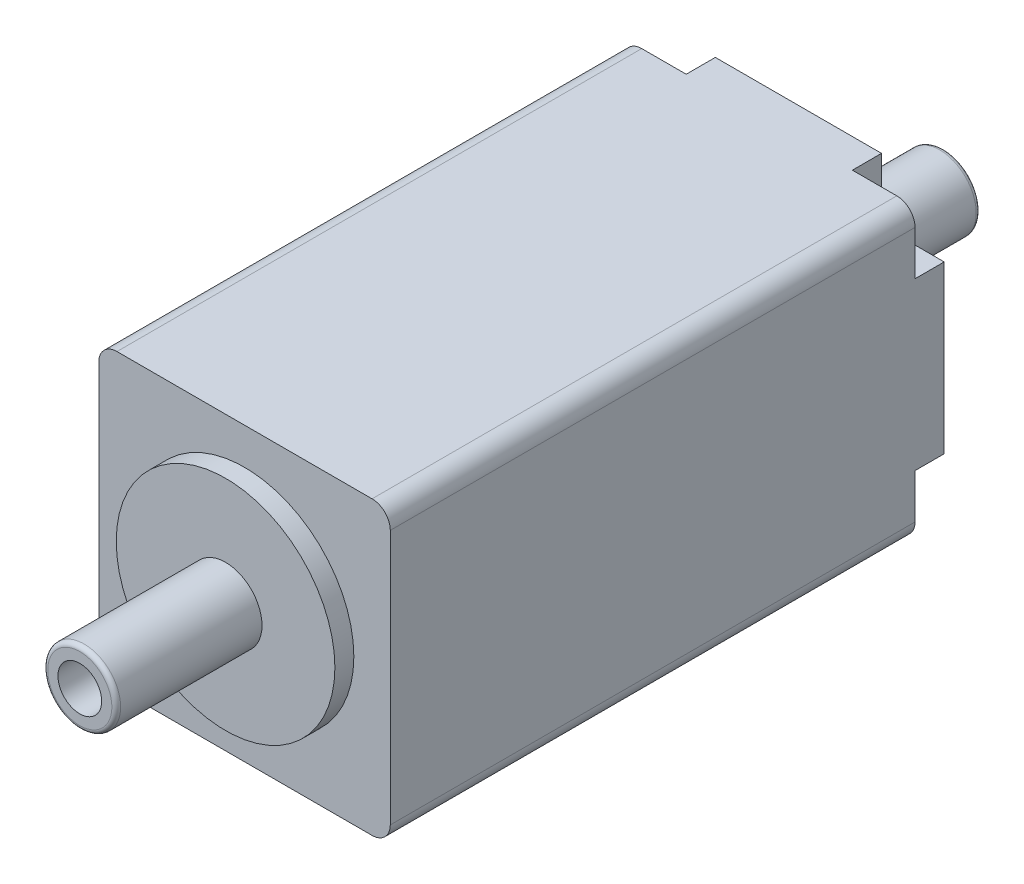
ISO-10303-21;
HEADER;
FILE_DESCRIPTION(('STEP AP214'),'2;1');
FILE_NAME('part.step','',(''),(''),'','','');
FILE_SCHEMA(('AUTOMOTIVE_DESIGN { 1 0 10303 214 1 1 1 1 }'));
ENDSEC;
DATA;
#1=APPLICATION_CONTEXT('core data for automotive mechanical design processes');
#2=APPLICATION_PROTOCOL_DEFINITION('international standard','automotive_design',2000,#1);
#3=PRODUCT_CONTEXT('',#1,'mechanical');
#4=PRODUCT('Part','Part','',(#3));
#5=PRODUCT_RELATED_PRODUCT_CATEGORY('part','',(#4));
#6=PRODUCT_DEFINITION_FORMATION('','',#4);
#7=PRODUCT_DEFINITION_CONTEXT('part definition',#1,'design');
#8=PRODUCT_DEFINITION('design','',#6,#7);
#9=PRODUCT_DEFINITION_SHAPE('','',#8);
#10=(LENGTH_UNIT() NAMED_UNIT(*) SI_UNIT(.MILLI.,.METRE.));
#11=(NAMED_UNIT(*) PLANE_ANGLE_UNIT() SI_UNIT($,.RADIAN.));
#12=(NAMED_UNIT(*) SI_UNIT($,.STERADIAN.) SOLID_ANGLE_UNIT());
#13=UNCERTAINTY_MEASURE_WITH_UNIT(LENGTH_MEASURE(1.E-05),#10,'distance_accuracy_value','');
#14=(GEOMETRIC_REPRESENTATION_CONTEXT(3) GLOBAL_UNCERTAINTY_ASSIGNED_CONTEXT((#13)) GLOBAL_UNIT_ASSIGNED_CONTEXT((#10,
#11,#12)) REPRESENTATION_CONTEXT('',''));
#15=CARTESIAN_POINT('',(0.,0.,0.));
#16=DIRECTION('',(0.,0.,1.));
#17=DIRECTION('',(1.,0.,0.));
#18=AXIS2_PLACEMENT_3D('',#15,#16,#17);
#19=CARTESIAN_POINT('',(-10.,0.,-38.));
#20=DIRECTION('',(1.,0.,0.));
#21=DIRECTION('',(0.,0.,-1.));
#22=AXIS2_PLACEMENT_3D('',#19,#20,#21);
#23=PLANE('',#22);
#24=DIRECTION('',(0.,1.,0.));
#25=VECTOR('',#24,1.);
#26=CARTESIAN_POINT('',(-9.99999999999999,10.,-36.));
#27=LINE('',#26,#25);
#28=CARTESIAN_POINT('',(-9.99999999999999,5.7,-36.));
#29=VERTEX_POINT('',#28);
#30=CARTESIAN_POINT('',(-9.99999999999999,8.75,-36.));
#31=VERTEX_POINT('',#30);
#32=EDGE_CURVE('E740',#29,#31,#27,.T.);
#33=ORIENTED_EDGE('',*,*,#32,.F.);
#34=DIRECTION('',(0.,0.,-1.));
#35=VECTOR('',#34,1.);
#36=CARTESIAN_POINT('',(-9.99999999999999,5.7,-36.));
#37=LINE('',#36,#35);
#38=CARTESIAN_POINT('',(-9.99999999999999,5.7,-38.));
#39=VERTEX_POINT('',#38);
#40=EDGE_CURVE('E661',#29,#39,#37,.T.);
#41=ORIENTED_EDGE('',*,*,#40,.T.);
#42=DIRECTION('',(0.,1.,0.));
#43=VECTOR('',#42,1.);
#44=CARTESIAN_POINT('',(-10.,0.,-38.));
#45=LINE('',#44,#43);
#46=CARTESIAN_POINT('',(-10.,-5.7,-38.));
#47=VERTEX_POINT('',#46);
#48=EDGE_CURVE('E273',#47,#39,#45,.T.);
#49=ORIENTED_EDGE('',*,*,#48,.F.);
#50=DIRECTION('',(0.,0.,-1.));
#51=VECTOR('',#50,1.);
#52=CARTESIAN_POINT('',(-10.,-5.7,-36.));
#53=LINE('',#52,#51);
#54=CARTESIAN_POINT('',(-10.,-5.7,-36.));
#55=VERTEX_POINT('',#54);
#56=EDGE_CURVE('E438',#55,#47,#53,.T.);
#57=ORIENTED_EDGE('',*,*,#56,.F.);
#58=DIRECTION('',(0.,1.,0.));
#59=VECTOR('',#58,1.);
#60=CARTESIAN_POINT('',(-10.,-5.7,-36.));
#61=LINE('',#60,#59);
#62=CARTESIAN_POINT('',(-10.,-8.75,-36.));
#63=VERTEX_POINT('',#62);
#64=EDGE_CURVE('E436',#63,#55,#61,.T.);
#65=ORIENTED_EDGE('',*,*,#64,.F.);
#66=DIRECTION('',(0.,0.,1.));
#67=VECTOR('',#66,1.);
#68=CARTESIAN_POINT('',(-10.,-8.74999999999999,-38.));
#69=LINE('',#68,#67);
#70=CARTESIAN_POINT('',(-10.,-8.74999999999999,0.));
#71=VERTEX_POINT('',#70);
#72=EDGE_CURVE('E319',#63,#71,#69,.T.);
#73=ORIENTED_EDGE('',*,*,#72,.T.);
#74=DIRECTION('',(0.,1.,0.));
#75=VECTOR('',#74,1.);
#76=CARTESIAN_POINT('',(-10.,0.,0.));
#77=LINE('',#76,#75);
#78=CARTESIAN_POINT('',(-10.,8.74999999999999,0.));
#79=VERTEX_POINT('',#78);
#80=EDGE_CURVE('E279',#71,#79,#77,.T.);
#81=ORIENTED_EDGE('',*,*,#80,.T.);
#82=DIRECTION('',(0.,0.,1.));
#83=VECTOR('',#82,1.);
#84=CARTESIAN_POINT('',(-10.,8.74999999999999,-38.));
#85=LINE('',#84,#83);
#86=EDGE_CURVE('E325',#31,#79,#85,.T.);
#87=ORIENTED_EDGE('',*,*,#86,.F.);
#88=EDGE_LOOP('',(#33,#41,#49,#57,#65,#73,#81,#87));
#89=FACE_BOUND('',#88,.T.);
#90=ADVANCED_FACE('F79',(#89),#23,.F.);
#91=CARTESIAN_POINT('',(0.,10.,-38.));
#92=DIRECTION('',(0.,1.,0.));
#93=DIRECTION('',(0.,0.,1.));
#94=AXIS2_PLACEMENT_3D('',#91,#92,#93);
#95=PLANE('',#94);
#96=DIRECTION('',(1.,0.,0.));
#97=VECTOR('',#96,1.);
#98=CARTESIAN_POINT('',(-5.69999999999999,10.,-36.));
#99=LINE('',#98,#97);
#100=CARTESIAN_POINT('',(-8.75,10.,-36.));
#101=VERTEX_POINT('',#100);
#102=CARTESIAN_POINT('',(-5.69999999999999,10.,-36.));
#103=VERTEX_POINT('',#102);
#104=EDGE_CURVE('E755',#101,#103,#99,.T.);
#105=ORIENTED_EDGE('',*,*,#104,.F.);
#106=DIRECTION('',(0.,0.,1.));
#107=VECTOR('',#106,1.);
#108=CARTESIAN_POINT('',(-8.74999999999999,10.,-38.));
#109=LINE('',#108,#107);
#110=CARTESIAN_POINT('',(-8.74999999999999,10.,0.));
#111=VERTEX_POINT('',#110);
#112=EDGE_CURVE('E323',#101,#111,#109,.T.);
#113=ORIENTED_EDGE('',*,*,#112,.T.);
#114=DIRECTION('',(-1.,0.,0.));
#115=VECTOR('',#114,1.);
#116=CARTESIAN_POINT('',(0.,10.,0.));
#117=LINE('',#116,#115);
#118=CARTESIAN_POINT('',(8.74999999999999,10.,0.));
#119=VERTEX_POINT('',#118);
#120=EDGE_CURVE('E310',#119,#111,#117,.T.);
#121=ORIENTED_EDGE('',*,*,#120,.F.);
#122=DIRECTION('',(0.,0.,1.));
#123=VECTOR('',#122,1.);
#124=CARTESIAN_POINT('',(8.74999999999999,10.,-38.));
#125=LINE('',#124,#123);
#126=CARTESIAN_POINT('',(8.75,9.99999999999999,-36.));
#127=VERTEX_POINT('',#126);
#128=EDGE_CURVE('E330',#127,#119,#125,.T.);
#129=ORIENTED_EDGE('',*,*,#128,.F.);
#130=DIRECTION('',(1.,0.,0.));
#131=VECTOR('',#130,1.);
#132=CARTESIAN_POINT('',(10.,9.99999999999999,-36.));
#133=LINE('',#132,#131);
#134=CARTESIAN_POINT('',(5.7,10.,-36.));
#135=VERTEX_POINT('',#134);
#136=EDGE_CURVE('E698',#135,#127,#133,.T.);
#137=ORIENTED_EDGE('',*,*,#136,.F.);
#138=DIRECTION('',(0.,0.,-1.));
#139=VECTOR('',#138,1.);
#140=CARTESIAN_POINT('',(5.7,10.,-36.));
#141=LINE('',#140,#139);
#142=CARTESIAN_POINT('',(5.7,10.,-38.));
#143=VERTEX_POINT('',#142);
#144=EDGE_CURVE('E704',#135,#143,#141,.T.);
#145=ORIENTED_EDGE('',*,*,#144,.T.);
#146=DIRECTION('',(-1.,0.,0.));
#147=VECTOR('',#146,1.);
#148=CARTESIAN_POINT('',(0.,10.,-38.));
#149=LINE('',#148,#147);
#150=CARTESIAN_POINT('',(-5.69999999999999,10.,-38.));
#151=VERTEX_POINT('',#150);
#152=EDGE_CURVE('E266',#143,#151,#149,.T.);
#153=ORIENTED_EDGE('',*,*,#152,.T.);
#154=DIRECTION('',(0.,0.,-1.));
#155=VECTOR('',#154,1.);
#156=CARTESIAN_POINT('',(-5.69999999999999,10.,-36.));
#157=LINE('',#156,#155);
#158=EDGE_CURVE('E733',#103,#151,#157,.T.);
#159=ORIENTED_EDGE('',*,*,#158,.F.);
#160=EDGE_LOOP('',(#105,#113,#121,#129,#137,#145,#153,#159));
#161=FACE_BOUND('',#160,.T.);
#162=ADVANCED_FACE('F382',(#161),#95,.T.);
#163=CARTESIAN_POINT('',(10.,0.,-38.));
#164=DIRECTION('',(1.,0.,0.));
#165=DIRECTION('',(0.,0.,-1.));
#166=AXIS2_PLACEMENT_3D('',#163,#164,#165);
#167=PLANE('',#166);
#168=DIRECTION('',(0.,-1.,0.));
#169=VECTOR('',#168,1.);
#170=CARTESIAN_POINT('',(10.,5.7,-36.));
#171=LINE('',#170,#169);
#172=CARTESIAN_POINT('',(10.,8.75,-36.));
#173=VERTEX_POINT('',#172);
#174=CARTESIAN_POINT('',(10.,5.7,-36.));
#175=VERTEX_POINT('',#174);
#176=EDGE_CURVE('E714',#173,#175,#171,.T.);
#177=ORIENTED_EDGE('',*,*,#176,.F.);
#178=DIRECTION('',(0.,0.,1.));
#179=VECTOR('',#178,1.);
#180=CARTESIAN_POINT('',(10.,8.74999999999999,-38.));
#181=LINE('',#180,#179);
#182=CARTESIAN_POINT('',(10.,8.74999999999999,0.));
#183=VERTEX_POINT('',#182);
#184=EDGE_CURVE('E332',#173,#183,#181,.T.);
#185=ORIENTED_EDGE('',*,*,#184,.T.);
#186=DIRECTION('',(0.,1.,0.));
#187=VECTOR('',#186,1.);
#188=CARTESIAN_POINT('',(10.,0.,0.));
#189=LINE('',#188,#187);
#190=CARTESIAN_POINT('',(10.,-8.74999999999999,0.));
#191=VERTEX_POINT('',#190);
#192=EDGE_CURVE('E299',#191,#183,#189,.T.);
#193=ORIENTED_EDGE('',*,*,#192,.F.);
#194=DIRECTION('',(0.,0.,1.));
#195=VECTOR('',#194,1.);
#196=CARTESIAN_POINT('',(10.,-8.74999999999999,-38.));
#197=LINE('',#196,#195);
#198=CARTESIAN_POINT('',(10.,-8.75,-36.));
#199=VERTEX_POINT('',#198);
#200=EDGE_CURVE('E331',#199,#191,#197,.T.);
#201=ORIENTED_EDGE('',*,*,#200,.F.);
#202=DIRECTION('',(0.,-1.,0.));
#203=VECTOR('',#202,1.);
#204=CARTESIAN_POINT('',(10.,-10.,-36.));
#205=LINE('',#204,#203);
#206=CARTESIAN_POINT('',(10.,-5.7,-36.));
#207=VERTEX_POINT('',#206);
#208=EDGE_CURVE('E265',#207,#199,#205,.T.);
#209=ORIENTED_EDGE('',*,*,#208,.F.);
#210=DIRECTION('',(0.,0.,-1.));
#211=VECTOR('',#210,1.);
#212=CARTESIAN_POINT('',(10.,-5.7,-36.));
#213=LINE('',#212,#211);
#214=CARTESIAN_POINT('',(10.,-5.7,-38.));
#215=VERTEX_POINT('',#214);
#216=EDGE_CURVE('E242',#207,#215,#213,.T.);
#217=ORIENTED_EDGE('',*,*,#216,.T.);
#218=DIRECTION('',(0.,1.,0.));
#219=VECTOR('',#218,1.);
#220=CARTESIAN_POINT('',(10.,0.,-38.));
#221=LINE('',#220,#219);
#222=CARTESIAN_POINT('',(10.,5.7,-38.));
#223=VERTEX_POINT('',#222);
#224=EDGE_CURVE('E262',#215,#223,#221,.T.);
#225=ORIENTED_EDGE('',*,*,#224,.T.);
#226=DIRECTION('',(0.,0.,-1.));
#227=VECTOR('',#226,1.);
#228=CARTESIAN_POINT('',(10.,5.7,-36.));
#229=LINE('',#228,#227);
#230=EDGE_CURVE('E694',#175,#223,#229,.T.);
#231=ORIENTED_EDGE('',*,*,#230,.F.);
#232=EDGE_LOOP('',(#177,#185,#193,#201,#209,#217,#225,#231));
#233=FACE_BOUND('',#232,.T.);
#234=ADVANCED_FACE('F256',(#233),#167,.T.);
#235=CARTESIAN_POINT('',(0.,-10.,-38.));
#236=DIRECTION('',(0.,1.,0.));
#237=DIRECTION('',(0.,0.,1.));
#238=AXIS2_PLACEMENT_3D('',#235,#236,#237);
#239=PLANE('',#238);
#240=DIRECTION('',(-1.,0.,0.));
#241=VECTOR('',#240,1.);
#242=CARTESIAN_POINT('',(5.7,-10.,-36.));
#243=LINE('',#242,#241);
#244=CARTESIAN_POINT('',(8.75,-10.,-36.));
#245=VERTEX_POINT('',#244);
#246=CARTESIAN_POINT('',(5.7,-10.,-36.));
#247=VERTEX_POINT('',#246);
#248=EDGE_CURVE('E254',#245,#247,#243,.T.);
#249=ORIENTED_EDGE('',*,*,#248,.F.);
#250=DIRECTION('',(0.,0.,1.));
#251=VECTOR('',#250,1.);
#252=CARTESIAN_POINT('',(8.74999999999999,-10.,-38.));
#253=LINE('',#252,#251);
#254=CARTESIAN_POINT('',(8.74999999999999,-10.,0.));
#255=VERTEX_POINT('',#254);
#256=EDGE_CURVE('E340',#245,#255,#253,.T.);
#257=ORIENTED_EDGE('',*,*,#256,.T.);
#258=DIRECTION('',(-1.,0.,0.));
#259=VECTOR('',#258,1.);
#260=CARTESIAN_POINT('',(0.,-10.,0.));
#261=LINE('',#260,#259);
#262=CARTESIAN_POINT('',(-8.74999999999999,-10.,0.));
#263=VERTEX_POINT('',#262);
#264=EDGE_CURVE('E288',#255,#263,#261,.T.);
#265=ORIENTED_EDGE('',*,*,#264,.T.);
#266=DIRECTION('',(0.,0.,1.));
#267=VECTOR('',#266,1.);
#268=CARTESIAN_POINT('',(-8.74999999999999,-10.,-38.));
#269=LINE('',#268,#267);
#270=CARTESIAN_POINT('',(-8.75,-10.,-36.));
#271=VERTEX_POINT('',#270);
#272=EDGE_CURVE('E283',#271,#263,#269,.T.);
#273=ORIENTED_EDGE('',*,*,#272,.F.);
#274=DIRECTION('',(-1.,0.,0.));
#275=VECTOR('',#274,1.);
#276=CARTESIAN_POINT('',(-10.,-10.,-36.));
#277=LINE('',#276,#275);
#278=CARTESIAN_POINT('',(-5.7,-10.,-36.));
#279=VERTEX_POINT('',#278);
#280=EDGE_CURVE('E428',#279,#271,#277,.T.);
#281=ORIENTED_EDGE('',*,*,#280,.F.);
#282=DIRECTION('',(0.,0.,-1.));
#283=VECTOR('',#282,1.);
#284=CARTESIAN_POINT('',(-5.7,-10.,-36.));
#285=LINE('',#284,#283);
#286=CARTESIAN_POINT('',(-5.7,-10.,-38.));
#287=VERTEX_POINT('',#286);
#288=EDGE_CURVE('E469',#279,#287,#285,.T.);
#289=ORIENTED_EDGE('',*,*,#288,.T.);
#290=DIRECTION('',(-1.,0.,0.));
#291=VECTOR('',#290,1.);
#292=CARTESIAN_POINT('',(0.,-10.,-38.));
#293=LINE('',#292,#291);
#294=CARTESIAN_POINT('',(5.7,-10.,-38.));
#295=VERTEX_POINT('',#294);
#296=EDGE_CURVE('E268',#295,#287,#293,.T.);
#297=ORIENTED_EDGE('',*,*,#296,.F.);
#298=DIRECTION('',(0.,0.,-1.));
#299=VECTOR('',#298,1.);
#300=CARTESIAN_POINT('',(5.7,-10.,-36.));
#301=LINE('',#300,#299);
#302=EDGE_CURVE('E670',#247,#295,#301,.T.);
#303=ORIENTED_EDGE('',*,*,#302,.F.);
#304=EDGE_LOOP('',(#249,#257,#265,#273,#281,#289,#297,#303));
#305=FACE_BOUND('',#304,.T.);
#306=ADVANCED_FACE('F410',(#305),#239,.F.);
#307=CARTESIAN_POINT('',(-8.75,-8.75,-38.));
#308=DIRECTION('',(0.,0.,1.));
#309=DIRECTION('',(1.,0.,0.));
#310=AXIS2_PLACEMENT_3D('',#307,#308,#309);
#311=CYLINDRICAL_SURFACE('',#310,1.25);
#312=CARTESIAN_POINT('',(-8.75,-8.75,-36.));
#313=DIRECTION('',(0.,0.,-1.));
#314=DIRECTION('',(-1.,0.,0.));
#315=AXIS2_PLACEMENT_3D('',#312,#313,#314);
#316=CIRCLE('',#315,1.25);
#317=EDGE_CURVE('E354',#271,#63,#316,.T.);
#318=ORIENTED_EDGE('',*,*,#317,.F.);
#319=ORIENTED_EDGE('',*,*,#272,.T.);
#320=CARTESIAN_POINT('',(-8.75,-8.75,0.));
#321=DIRECTION('',(0.,0.,1.));
#322=DIRECTION('',(1.,0.,0.));
#323=AXIS2_PLACEMENT_3D('',#320,#321,#322);
#324=CIRCLE('',#323,1.25);
#325=EDGE_CURVE('E287',#263,#71,#324,.F.);
#326=ORIENTED_EDGE('',*,*,#325,.T.);
#327=ORIENTED_EDGE('',*,*,#72,.F.);
#328=EDGE_LOOP('',(#318,#319,#326,#327));
#329=FACE_BOUND('',#328,.T.);
#330=ADVANCED_FACE('F400',(#329),#311,.T.);
#331=CARTESIAN_POINT('',(-8.75,8.75,-38.));
#332=DIRECTION('',(0.,0.,1.));
#333=DIRECTION('',(1.,0.,0.));
#334=AXIS2_PLACEMENT_3D('',#331,#332,#333);
#335=CYLINDRICAL_SURFACE('',#334,1.25);
#336=CARTESIAN_POINT('',(-8.75,8.75,-36.));
#337=DIRECTION('',(0.,0.,-1.));
#338=DIRECTION('',(-1.,0.,0.));
#339=AXIS2_PLACEMENT_3D('',#336,#337,#338);
#340=CIRCLE('',#339,1.25);
#341=EDGE_CURVE('E346',#31,#101,#340,.T.);
#342=ORIENTED_EDGE('',*,*,#341,.F.);
#343=ORIENTED_EDGE('',*,*,#86,.T.);
#344=CARTESIAN_POINT('',(-8.75,8.75,0.));
#345=DIRECTION('',(0.,0.,1.));
#346=DIRECTION('',(1.,0.,0.));
#347=AXIS2_PLACEMENT_3D('',#344,#345,#346);
#348=CIRCLE('',#347,1.25);
#349=EDGE_CURVE('E311',#79,#111,#348,.F.);
#350=ORIENTED_EDGE('',*,*,#349,.T.);
#351=ORIENTED_EDGE('',*,*,#112,.F.);
#352=EDGE_LOOP('',(#342,#343,#350,#351));
#353=FACE_BOUND('',#352,.T.);
#354=ADVANCED_FACE('F393',(#353),#335,.T.);
#355=CARTESIAN_POINT('',(8.75,8.75,-38.));
#356=DIRECTION('',(0.,0.,1.));
#357=DIRECTION('',(1.,0.,0.));
#358=AXIS2_PLACEMENT_3D('',#355,#356,#357);
#359=CYLINDRICAL_SURFACE('',#358,1.25);
#360=ORIENTED_EDGE('',*,*,#184,.F.);
#361=CARTESIAN_POINT('',(8.75,8.75,-36.));
#362=DIRECTION('',(0.,0.,-1.));
#363=DIRECTION('',(-1.,0.,0.));
#364=AXIS2_PLACEMENT_3D('',#361,#362,#363);
#365=CIRCLE('',#364,1.25);
#366=EDGE_CURVE('E343',#173,#127,#365,.F.);
#367=ORIENTED_EDGE('',*,*,#366,.T.);
#368=ORIENTED_EDGE('',*,*,#128,.T.);
#369=CARTESIAN_POINT('',(8.75,8.75,0.));
#370=DIRECTION('',(0.,0.,1.));
#371=DIRECTION('',(1.,0.,0.));
#372=AXIS2_PLACEMENT_3D('',#369,#370,#371);
#373=CIRCLE('',#372,1.25);
#374=EDGE_CURVE('E303',#183,#119,#373,.T.);
#375=ORIENTED_EDGE('',*,*,#374,.F.);
#376=EDGE_LOOP('',(#360,#367,#368,#375));
#377=FACE_BOUND('',#376,.T.);
#378=ADVANCED_FACE('F399',(#377),#359,.T.);
#379=CARTESIAN_POINT('',(8.75,-8.75,-38.));
#380=DIRECTION('',(0.,0.,1.));
#381=DIRECTION('',(1.,0.,0.));
#382=AXIS2_PLACEMENT_3D('',#379,#380,#381);
#383=CYLINDRICAL_SURFACE('',#382,1.25);
#384=CARTESIAN_POINT('',(8.75,-8.75,-36.));
#385=DIRECTION('',(0.,0.,-1.));
#386=DIRECTION('',(-1.,0.,0.));
#387=AXIS2_PLACEMENT_3D('',#384,#385,#386);
#388=CIRCLE('',#387,1.25);
#389=EDGE_CURVE('E345',#199,#245,#388,.T.);
#390=ORIENTED_EDGE('',*,*,#389,.F.);
#391=ORIENTED_EDGE('',*,*,#200,.T.);
#392=CARTESIAN_POINT('',(8.75,-8.75,0.));
#393=DIRECTION('',(0.,0.,1.));
#394=DIRECTION('',(1.,0.,0.));
#395=AXIS2_PLACEMENT_3D('',#392,#393,#394);
#396=CIRCLE('',#395,1.25);
#397=EDGE_CURVE('E294',#191,#255,#396,.F.);
#398=ORIENTED_EDGE('',*,*,#397,.T.);
#399=ORIENTED_EDGE('',*,*,#256,.F.);
#400=EDGE_LOOP('',(#390,#391,#398,#399));
#401=FACE_BOUND('',#400,.T.);
#402=ADVANCED_FACE('F401',(#401),#383,.T.);
#403=CARTESIAN_POINT('',(0.,0.,-38.));
#404=DIRECTION('',(0.,0.,1.));
#405=DIRECTION('',(1.,0.,0.));
#406=AXIS2_PLACEMENT_3D('',#403,#404,#405);
#407=PLANE('',#406);
#408=CARTESIAN_POINT('',(0.,0.,-38.));
#409=DIRECTION('',(0.,0.,-1.));
#410=DIRECTION('',(-1.,0.,0.));
#411=AXIS2_PLACEMENT_3D('',#408,#409,#410);
#412=CIRCLE('',#411,2.5);
#413=CARTESIAN_POINT('',(-2.5,0.,-38.));
#414=VERTEX_POINT('',#413);
#415=EDGE_CURVE('E363',#414,#414,#412,.T.);
#416=ORIENTED_EDGE('',*,*,#415,.F.);
#417=EDGE_LOOP('',(#416));
#418=FACE_BOUND('',#417,.T.);
#419=DIRECTION('',(0.,-1.,0.));
#420=VECTOR('',#419,1.);
#421=CARTESIAN_POINT('',(-5.69999999999999,10.,-38.));
#422=LINE('',#421,#420);
#423=CARTESIAN_POINT('',(-5.69999999999999,7.2,-38.));
#424=VERTEX_POINT('',#423);
#425=EDGE_CURVE('E93',#151,#424,#422,.T.);
#426=ORIENTED_EDGE('',*,*,#425,.F.);
#427=ORIENTED_EDGE('',*,*,#152,.F.);
#428=DIRECTION('',(0.,1.,0.));
#429=VECTOR('',#428,1.);
#430=CARTESIAN_POINT('',(5.7,7.2,-38.));
#431=LINE('',#430,#429);
#432=CARTESIAN_POINT('',(5.7,7.2,-38.));
#433=VERTEX_POINT('',#432);
#434=EDGE_CURVE('E706',#433,#143,#431,.T.);
#435=ORIENTED_EDGE('',*,*,#434,.F.);
#436=CARTESIAN_POINT('',(7.2,7.2,-38.));
#437=DIRECTION('',(0.,0.,-1.));
#438=DIRECTION('',(-1.,0.,0.));
#439=AXIS2_PLACEMENT_3D('',#436,#437,#438);
#440=CIRCLE('',#439,1.5);
#441=CARTESIAN_POINT('',(7.2,5.7,-38.));
#442=VERTEX_POINT('',#441);
#443=EDGE_CURVE('E715',#442,#433,#440,.T.);
#444=ORIENTED_EDGE('',*,*,#443,.F.);
#445=DIRECTION('',(-1.,0.,0.));
#446=VECTOR('',#445,1.);
#447=CARTESIAN_POINT('',(10.,5.7,-38.));
#448=LINE('',#447,#446);
#449=EDGE_CURVE('E101',#223,#442,#448,.T.);
#450=ORIENTED_EDGE('',*,*,#449,.F.);
#451=ORIENTED_EDGE('',*,*,#224,.F.);
#452=DIRECTION('',(1.,0.,0.));
#453=VECTOR('',#452,1.);
#454=CARTESIAN_POINT('',(7.2,-5.7,-38.));
#455=LINE('',#454,#453);
#456=CARTESIAN_POINT('',(7.2,-5.7,-38.));
#457=VERTEX_POINT('',#456);
#458=EDGE_CURVE('E239',#457,#215,#455,.T.);
#459=ORIENTED_EDGE('',*,*,#458,.F.);
#460=CARTESIAN_POINT('',(7.2,-7.2,-38.));
#461=DIRECTION('',(0.,0.,-1.));
#462=DIRECTION('',(-1.,0.,0.));
#463=AXIS2_PLACEMENT_3D('',#460,#461,#462);
#464=CIRCLE('',#463,1.5);
#465=CARTESIAN_POINT('',(5.7,-7.2,-38.));
#466=VERTEX_POINT('',#465);
#467=EDGE_CURVE('E255',#466,#457,#464,.T.);
#468=ORIENTED_EDGE('',*,*,#467,.F.);
#469=DIRECTION('',(0.,1.,0.));
#470=VECTOR('',#469,1.);
#471=CARTESIAN_POINT('',(5.7,-10.,-38.));
#472=LINE('',#471,#470);
#473=EDGE_CURVE('E465',#295,#466,#472,.T.);
#474=ORIENTED_EDGE('',*,*,#473,.F.);
#475=ORIENTED_EDGE('',*,*,#296,.T.);
#476=DIRECTION('',(0.,-1.,0.));
#477=VECTOR('',#476,1.);
#478=CARTESIAN_POINT('',(-5.7,-7.2,-38.));
#479=LINE('',#478,#477);
#480=CARTESIAN_POINT('',(-5.7,-7.2,-38.));
#481=VERTEX_POINT('',#480);
#482=EDGE_CURVE('E449',#481,#287,#479,.T.);
#483=ORIENTED_EDGE('',*,*,#482,.F.);
#484=CARTESIAN_POINT('',(-7.2,-7.2,-38.));
#485=DIRECTION('',(0.,0.,-1.));
#486=DIRECTION('',(-1.,0.,0.));
#487=AXIS2_PLACEMENT_3D('',#484,#485,#486);
#488=CIRCLE('',#487,1.5);
#489=CARTESIAN_POINT('',(-7.2,-5.7,-38.));
#490=VERTEX_POINT('',#489);
#491=EDGE_CURVE('E464',#490,#481,#488,.T.);
#492=ORIENTED_EDGE('',*,*,#491,.F.);
#493=DIRECTION('',(1.,0.,0.));
#494=VECTOR('',#493,1.);
#495=CARTESIAN_POINT('',(-10.,-5.7,-38.));
#496=LINE('',#495,#494);
#497=EDGE_CURVE('E456',#47,#490,#496,.T.);
#498=ORIENTED_EDGE('',*,*,#497,.F.);
#499=ORIENTED_EDGE('',*,*,#48,.T.);
#500=DIRECTION('',(-1.,0.,0.));
#501=VECTOR('',#500,1.);
#502=CARTESIAN_POINT('',(-7.2,5.7,-38.));
#503=LINE('',#502,#501);
#504=CARTESIAN_POINT('',(-7.2,5.7,-38.));
#505=VERTEX_POINT('',#504);
#506=EDGE_CURVE('E746',#505,#39,#503,.T.);
#507=ORIENTED_EDGE('',*,*,#506,.F.);
#508=CARTESIAN_POINT('',(-7.19999999999999,7.2,-38.));
#509=DIRECTION('',(0.,0.,-1.));
#510=DIRECTION('',(-1.,0.,0.));
#511=AXIS2_PLACEMENT_3D('',#508,#509,#510);
#512=CIRCLE('',#511,1.5);
#513=EDGE_CURVE('E753',#424,#505,#512,.T.);
#514=ORIENTED_EDGE('',*,*,#513,.F.);
#515=EDGE_LOOP('',(#426,#427,#435,#444,#450,#451,#459,#468,#474,#475,#483,#492,#498,#499,#507,#514));
#516=FACE_BOUND('',#515,.T.);
#517=ADVANCED_FACE('F267',(#418,#516),#407,.F.);
#518=CARTESIAN_POINT('',(0.,0.,0.));
#519=DIRECTION('',(0.,0.,1.));
#520=DIRECTION('',(1.,0.,0.));
#521=AXIS2_PLACEMENT_3D('',#518,#519,#520);
#522=PLANE('',#521);
#523=CARTESIAN_POINT('',(0.,0.,0.));
#524=DIRECTION('',(0.,0.,1.));
#525=DIRECTION('',(1.,0.,0.));
#526=AXIS2_PLACEMENT_3D('',#523,#524,#525);
#527=CIRCLE('',#526,7.5);
#528=CARTESIAN_POINT('',(7.5,0.,0.));
#529=VERTEX_POINT('',#528);
#530=EDGE_CURVE('E322',#529,#529,#527,.T.);
#531=ORIENTED_EDGE('',*,*,#530,.F.);
#532=EDGE_LOOP('',(#531));
#533=FACE_BOUND('',#532,.T.);
#534=ORIENTED_EDGE('',*,*,#325,.F.);
#535=ORIENTED_EDGE('',*,*,#264,.F.);
#536=ORIENTED_EDGE('',*,*,#397,.F.);
#537=ORIENTED_EDGE('',*,*,#192,.T.);
#538=ORIENTED_EDGE('',*,*,#374,.T.);
#539=ORIENTED_EDGE('',*,*,#120,.T.);
#540=ORIENTED_EDGE('',*,*,#349,.F.);
#541=ORIENTED_EDGE('',*,*,#80,.F.);
#542=EDGE_LOOP('',(#534,#535,#536,#537,#538,#539,#540,#541));
#543=FACE_BOUND('',#542,.T.);
#544=ADVANCED_FACE('F395',(#533,#543),#522,.T.);
#545=CARTESIAN_POINT('',(0.,0.,-38.));
#546=DIRECTION('',(0.,0.,1.));
#547=DIRECTION('',(1.,0.,0.));
#548=AXIS2_PLACEMENT_3D('',#545,#546,#547);
#549=CYLINDRICAL_SURFACE('',#548,1.5);
#550=CARTESIAN_POINT('',(0.,0.,11.3));
#551=DIRECTION('',(0.,0.,1.));
#552=DIRECTION('',(1.,0.,0.));
#553=AXIS2_PLACEMENT_3D('',#550,#551,#552);
#554=CIRCLE('',#553,1.5);
#555=CARTESIAN_POINT('',(1.5,0.,11.3));
#556=VERTEX_POINT('',#555);
#557=EDGE_CURVE('E625',#556,#556,#554,.T.);
#558=ORIENTED_EDGE('',*,*,#557,.T.);
#559=EDGE_LOOP('',(#558));
#560=FACE_BOUND('',#559,.T.);
#561=CARTESIAN_POINT('',(0.,0.,-48.));
#562=DIRECTION('',(0.,0.,-1.));
#563=DIRECTION('',(-1.,0.,0.));
#564=AXIS2_PLACEMENT_3D('',#561,#562,#563);
#565=CIRCLE('',#564,1.5);
#566=CARTESIAN_POINT('',(-1.5,0.,-48.));
#567=VERTEX_POINT('',#566);
#568=EDGE_CURVE('E620',#567,#567,#565,.T.);
#569=ORIENTED_EDGE('',*,*,#568,.T.);
#570=EDGE_LOOP('',(#569));
#571=FACE_BOUND('',#570,.T.);
#572=ADVANCED_FACE('F489',(#560,#571),#549,.F.);
#573=CARTESIAN_POINT('',(0.,0.,1.3));
#574=DIRECTION('',(0.,0.,1.));
#575=DIRECTION('',(1.,0.,0.));
#576=AXIS2_PLACEMENT_3D('',#573,#574,#575);
#577=PLANE('',#576);
#578=CARTESIAN_POINT('',(0.,0.,1.3));
#579=DIRECTION('',(0.,0.,1.));
#580=DIRECTION('',(1.,0.,0.));
#581=AXIS2_PLACEMENT_3D('',#578,#579,#580);
#582=CIRCLE('',#581,2.5);
#583=CARTESIAN_POINT('',(2.5,0.,1.3));
#584=VERTEX_POINT('',#583);
#585=EDGE_CURVE('E353',#584,#584,#582,.T.);
#586=ORIENTED_EDGE('',*,*,#585,.F.);
#587=EDGE_LOOP('',(#586));
#588=FACE_BOUND('',#587,.T.);
#589=CARTESIAN_POINT('',(0.,0.,1.3));
#590=DIRECTION('',(0.,0.,1.));
#591=DIRECTION('',(1.,0.,0.));
#592=AXIS2_PLACEMENT_3D('',#589,#590,#591);
#593=CIRCLE('',#592,7.5);
#594=CARTESIAN_POINT('',(7.5,0.,1.3));
#595=VERTEX_POINT('',#594);
#596=EDGE_CURVE('E293',#595,#595,#593,.T.);
#597=ORIENTED_EDGE('',*,*,#596,.T.);
#598=EDGE_LOOP('',(#597));
#599=FACE_BOUND('',#598,.T.);
#600=ADVANCED_FACE('F494',(#588,#599),#577,.T.);
#601=CARTESIAN_POINT('',(0.,0.,1.3));
#602=DIRECTION('',(0.,0.,-1.));
#603=DIRECTION('',(-1.,0.,0.));
#604=AXIS2_PLACEMENT_3D('',#601,#602,#603);
#605=CYLINDRICAL_SURFACE('',#604,7.5);
#606=ORIENTED_EDGE('',*,*,#596,.F.);
#607=EDGE_LOOP('',(#606));
#608=FACE_BOUND('',#607,.T.);
#609=ORIENTED_EDGE('',*,*,#530,.T.);
#610=EDGE_LOOP('',(#609));
#611=FACE_BOUND('',#610,.T.);
#612=ADVANCED_FACE('F487',(#608,#611),#605,.T.);
#613=CARTESIAN_POINT('',(-7.2,-7.2,-36.));
#614=DIRECTION('',(0.,0.,-1.));
#615=DIRECTION('',(-1.,0.,0.));
#616=AXIS2_PLACEMENT_3D('',#613,#614,#615);
#617=PLANE('',#616);
#618=CARTESIAN_POINT('',(-7.7,-7.7,-36.));
#619=DIRECTION('',(0.,0.,-1.));
#620=DIRECTION('',(-1.,0.,0.));
#621=AXIS2_PLACEMENT_3D('',#618,#619,#620);
#622=CIRCLE('',#621,1.05);
#623=CARTESIAN_POINT('',(-8.75,-7.7,-36.));
#624=VERTEX_POINT('',#623);
#625=EDGE_CURVE('E641',#624,#624,#622,.T.);
#626=ORIENTED_EDGE('',*,*,#625,.F.);
#627=EDGE_LOOP('',(#626));
#628=FACE_BOUND('',#627,.T.);
#629=ORIENTED_EDGE('',*,*,#317,.T.);
#630=ORIENTED_EDGE('',*,*,#64,.T.);
#631=DIRECTION('',(1.,0.,0.));
#632=VECTOR('',#631,1.);
#633=CARTESIAN_POINT('',(-10.,-5.7,-36.));
#634=LINE('',#633,#632);
#635=CARTESIAN_POINT('',(-7.2,-5.7,-36.));
#636=VERTEX_POINT('',#635);
#637=EDGE_CURVE('E445',#55,#636,#634,.T.);
#638=ORIENTED_EDGE('',*,*,#637,.T.);
#639=CARTESIAN_POINT('',(-7.2,-7.2,-36.));
#640=DIRECTION('',(0.,0.,-1.));
#641=DIRECTION('',(-1.,0.,0.));
#642=AXIS2_PLACEMENT_3D('',#639,#640,#641);
#643=CIRCLE('',#642,1.5);
#644=CARTESIAN_POINT('',(-5.7,-7.2,-36.));
#645=VERTEX_POINT('',#644);
#646=EDGE_CURVE('E447',#636,#645,#643,.T.);
#647=ORIENTED_EDGE('',*,*,#646,.T.);
#648=DIRECTION('',(0.,-1.,0.));
#649=VECTOR('',#648,1.);
#650=CARTESIAN_POINT('',(-5.7,-7.2,-36.));
#651=LINE('',#650,#649);
#652=EDGE_CURVE('E453',#645,#279,#651,.T.);
#653=ORIENTED_EDGE('',*,*,#652,.T.);
#654=ORIENTED_EDGE('',*,*,#280,.T.);
#655=EDGE_LOOP('',(#629,#630,#638,#647,#653,#654));
#656=FACE_BOUND('',#655,.T.);
#657=ADVANCED_FACE('F506',(#628,#656),#617,.T.);
#658=CARTESIAN_POINT('',(-5.7,-7.2,-36.));
#659=DIRECTION('',(1.,0.,0.));
#660=DIRECTION('',(0.,0.,-1.));
#661=AXIS2_PLACEMENT_3D('',#658,#659,#660);
#662=PLANE('',#661);
#663=ORIENTED_EDGE('',*,*,#482,.T.);
#664=ORIENTED_EDGE('',*,*,#288,.F.);
#665=ORIENTED_EDGE('',*,*,#652,.F.);
#666=DIRECTION('',(0.,0.,-1.));
#667=VECTOR('',#666,1.);
#668=CARTESIAN_POINT('',(-5.7,-7.2,-36.));
#669=LINE('',#668,#667);
#670=EDGE_CURVE('E475',#645,#481,#669,.T.);
#671=ORIENTED_EDGE('',*,*,#670,.T.);
#672=EDGE_LOOP('',(#663,#664,#665,#671));
#673=FACE_BOUND('',#672,.T.);
#674=ADVANCED_FACE('F519',(#673),#662,.F.);
#675=CARTESIAN_POINT('',(-7.2,-7.2,-36.));
#676=DIRECTION('',(0.,0.,-1.));
#677=DIRECTION('',(-1.,0.,0.));
#678=AXIS2_PLACEMENT_3D('',#675,#676,#677);
#679=CYLINDRICAL_SURFACE('',#678,1.5);
#680=ORIENTED_EDGE('',*,*,#491,.T.);
#681=ORIENTED_EDGE('',*,*,#670,.F.);
#682=ORIENTED_EDGE('',*,*,#646,.F.);
#683=DIRECTION('',(0.,0.,-1.));
#684=VECTOR('',#683,1.);
#685=CARTESIAN_POINT('',(-7.2,-5.7,-36.));
#686=LINE('',#685,#684);
#687=EDGE_CURVE('E473',#636,#490,#686,.T.);
#688=ORIENTED_EDGE('',*,*,#687,.T.);
#689=EDGE_LOOP('',(#680,#681,#682,#688));
#690=FACE_BOUND('',#689,.T.);
#691=ADVANCED_FACE('F511',(#690),#679,.F.);
#692=CARTESIAN_POINT('',(-10.,-5.7,-36.));
#693=DIRECTION('',(0.,1.,0.));
#694=DIRECTION('',(0.,0.,1.));
#695=AXIS2_PLACEMENT_3D('',#692,#693,#694);
#696=PLANE('',#695);
#697=ORIENTED_EDGE('',*,*,#497,.T.);
#698=ORIENTED_EDGE('',*,*,#687,.F.);
#699=ORIENTED_EDGE('',*,*,#637,.F.);
#700=ORIENTED_EDGE('',*,*,#56,.T.);
#701=EDGE_LOOP('',(#697,#698,#699,#700));
#702=FACE_BOUND('',#701,.T.);
#703=ADVANCED_FACE('F509',(#702),#696,.F.);
#704=CARTESIAN_POINT('',(7.2,-7.2,-36.));
#705=DIRECTION('',(0.,0.,-1.));
#706=DIRECTION('',(-1.,0.,0.));
#707=AXIS2_PLACEMENT_3D('',#704,#705,#706);
#708=PLANE('',#707);
#709=CARTESIAN_POINT('',(7.7,-7.7,-36.));
#710=DIRECTION('',(0.,0.,-1.));
#711=DIRECTION('',(-1.,0.,0.));
#712=AXIS2_PLACEMENT_3D('',#709,#710,#711);
#713=CIRCLE('',#712,1.05);
#714=CARTESIAN_POINT('',(6.65,-7.7,-36.));
#715=VERTEX_POINT('',#714);
#716=EDGE_CURVE('E638',#715,#715,#713,.T.);
#717=ORIENTED_EDGE('',*,*,#716,.F.);
#718=EDGE_LOOP('',(#717));
#719=FACE_BOUND('',#718,.T.);
#720=ORIENTED_EDGE('',*,*,#389,.T.);
#721=ORIENTED_EDGE('',*,*,#248,.T.);
#722=DIRECTION('',(0.,1.,0.));
#723=VECTOR('',#722,1.);
#724=CARTESIAN_POINT('',(5.7,-10.,-36.));
#725=LINE('',#724,#723);
#726=CARTESIAN_POINT('',(5.7,-7.2,-36.));
#727=VERTEX_POINT('',#726);
#728=EDGE_CURVE('E689',#247,#727,#725,.T.);
#729=ORIENTED_EDGE('',*,*,#728,.T.);
#730=CARTESIAN_POINT('',(7.2,-7.2,-36.));
#731=DIRECTION('',(0.,0.,-1.));
#732=DIRECTION('',(-1.,0.,0.));
#733=AXIS2_PLACEMENT_3D('',#730,#731,#732);
#734=CIRCLE('',#733,1.5);
#735=CARTESIAN_POINT('',(7.2,-5.7,-36.));
#736=VERTEX_POINT('',#735);
#737=EDGE_CURVE('E684',#727,#736,#734,.T.);
#738=ORIENTED_EDGE('',*,*,#737,.T.);
#739=DIRECTION('',(1.,0.,0.));
#740=VECTOR('',#739,1.);
#741=CARTESIAN_POINT('',(7.2,-5.7,-36.));
#742=LINE('',#741,#740);
#743=EDGE_CURVE('E682',#736,#207,#742,.T.);
#744=ORIENTED_EDGE('',*,*,#743,.T.);
#745=ORIENTED_EDGE('',*,*,#208,.T.);
#746=EDGE_LOOP('',(#720,#721,#729,#738,#744,#745));
#747=FACE_BOUND('',#746,.T.);
#748=ADVANCED_FACE('F514',(#719,#747),#708,.T.);
#749=CARTESIAN_POINT('',(7.2,-5.7,-36.));
#750=DIRECTION('',(0.,1.,0.));
#751=DIRECTION('',(0.,0.,1.));
#752=AXIS2_PLACEMENT_3D('',#749,#750,#751);
#753=PLANE('',#752);
#754=ORIENTED_EDGE('',*,*,#458,.T.);
#755=ORIENTED_EDGE('',*,*,#216,.F.);
#756=ORIENTED_EDGE('',*,*,#743,.F.);
#757=DIRECTION('',(0.,0.,-1.));
#758=VECTOR('',#757,1.);
#759=CARTESIAN_POINT('',(7.2,-5.7,-36.));
#760=LINE('',#759,#758);
#761=EDGE_CURVE('E246',#736,#457,#760,.T.);
#762=ORIENTED_EDGE('',*,*,#761,.T.);
#763=EDGE_LOOP('',(#754,#755,#756,#762));
#764=FACE_BOUND('',#763,.T.);
#765=ADVANCED_FACE('F245',(#764),#753,.F.);
#766=CARTESIAN_POINT('',(7.2,-7.2,-36.));
#767=DIRECTION('',(0.,0.,-1.));
#768=DIRECTION('',(-1.,0.,0.));
#769=AXIS2_PLACEMENT_3D('',#766,#767,#768);
#770=CYLINDRICAL_SURFACE('',#769,1.5);
#771=ORIENTED_EDGE('',*,*,#467,.T.);
#772=ORIENTED_EDGE('',*,*,#761,.F.);
#773=ORIENTED_EDGE('',*,*,#737,.F.);
#774=DIRECTION('',(0.,0.,-1.));
#775=VECTOR('',#774,1.);
#776=CARTESIAN_POINT('',(5.7,-7.2,-36.));
#777=LINE('',#776,#775);
#778=EDGE_CURVE('E668',#727,#466,#777,.T.);
#779=ORIENTED_EDGE('',*,*,#778,.T.);
#780=EDGE_LOOP('',(#771,#772,#773,#779));
#781=FACE_BOUND('',#780,.T.);
#782=ADVANCED_FACE('F563',(#781),#770,.F.);
#783=CARTESIAN_POINT('',(5.7,-10.,-36.));
#784=DIRECTION('',(-1.,0.,0.));
#785=DIRECTION('',(0.,0.,1.));
#786=AXIS2_PLACEMENT_3D('',#783,#784,#785);
#787=PLANE('',#786);
#788=ORIENTED_EDGE('',*,*,#473,.T.);
#789=ORIENTED_EDGE('',*,*,#778,.F.);
#790=ORIENTED_EDGE('',*,*,#728,.F.);
#791=ORIENTED_EDGE('',*,*,#302,.T.);
#792=EDGE_LOOP('',(#788,#789,#790,#791));
#793=FACE_BOUND('',#792,.T.);
#794=ADVANCED_FACE('F553',(#793),#787,.F.);
#795=CARTESIAN_POINT('',(5.7,7.2,-36.));
#796=DIRECTION('',(-1.,0.,0.));
#797=DIRECTION('',(0.,0.,1.));
#798=AXIS2_PLACEMENT_3D('',#795,#796,#797);
#799=PLANE('',#798);
#800=ORIENTED_EDGE('',*,*,#434,.T.);
#801=ORIENTED_EDGE('',*,*,#144,.F.);
#802=DIRECTION('',(0.,1.,0.));
#803=VECTOR('',#802,1.);
#804=CARTESIAN_POINT('',(5.7,7.2,-36.));
#805=LINE('',#804,#803);
#806=CARTESIAN_POINT('',(5.7,7.2,-36.));
#807=VERTEX_POINT('',#806);
#808=EDGE_CURVE('E722',#807,#135,#805,.T.);
#809=ORIENTED_EDGE('',*,*,#808,.F.);
#810=DIRECTION('',(0.,0.,-1.));
#811=VECTOR('',#810,1.);
#812=CARTESIAN_POINT('',(5.7,7.2,-36.));
#813=LINE('',#812,#811);
#814=EDGE_CURVE('E705',#807,#433,#813,.T.);
#815=ORIENTED_EDGE('',*,*,#814,.T.);
#816=EDGE_LOOP('',(#800,#801,#809,#815));
#817=FACE_BOUND('',#816,.T.);
#818=ADVANCED_FACE('F549',(#817),#799,.F.);
#819=CARTESIAN_POINT('',(7.2,7.2,-36.));
#820=DIRECTION('',(0.,0.,-1.));
#821=DIRECTION('',(-1.,0.,0.));
#822=AXIS2_PLACEMENT_3D('',#819,#820,#821);
#823=CYLINDRICAL_SURFACE('',#822,1.5);
#824=ORIENTED_EDGE('',*,*,#443,.T.);
#825=ORIENTED_EDGE('',*,*,#814,.F.);
#826=CARTESIAN_POINT('',(7.2,7.2,-36.));
#827=DIRECTION('',(0.,0.,-1.));
#828=DIRECTION('',(-1.,0.,0.));
#829=AXIS2_PLACEMENT_3D('',#826,#827,#828);
#830=CIRCLE('',#829,1.5);
#831=CARTESIAN_POINT('',(7.2,5.7,-36.));
#832=VERTEX_POINT('',#831);
#833=EDGE_CURVE('E723',#832,#807,#830,.T.);
#834=ORIENTED_EDGE('',*,*,#833,.F.);
#835=DIRECTION('',(0.,0.,-1.));
#836=VECTOR('',#835,1.);
#837=CARTESIAN_POINT('',(7.2,5.7,-36.));
#838=LINE('',#837,#836);
#839=EDGE_CURVE('E697',#832,#442,#838,.T.);
#840=ORIENTED_EDGE('',*,*,#839,.T.);
#841=EDGE_LOOP('',(#824,#825,#834,#840));
#842=FACE_BOUND('',#841,.T.);
#843=ADVANCED_FACE('F548',(#842),#823,.F.);
#844=CARTESIAN_POINT('',(10.,5.7,-36.));
#845=DIRECTION('',(0.,-1.,0.));
#846=DIRECTION('',(0.,0.,-1.));
#847=AXIS2_PLACEMENT_3D('',#844,#845,#846);
#848=PLANE('',#847);
#849=ORIENTED_EDGE('',*,*,#449,.T.);
#850=ORIENTED_EDGE('',*,*,#839,.F.);
#851=DIRECTION('',(-1.,0.,0.));
#852=VECTOR('',#851,1.);
#853=CARTESIAN_POINT('',(10.,5.7,-36.));
#854=LINE('',#853,#852);
#855=EDGE_CURVE('E729',#175,#832,#854,.T.);
#856=ORIENTED_EDGE('',*,*,#855,.F.);
#857=ORIENTED_EDGE('',*,*,#230,.T.);
#858=EDGE_LOOP('',(#849,#850,#856,#857));
#859=FACE_BOUND('',#858,.T.);
#860=ADVANCED_FACE('F543',(#859),#848,.F.);
#861=CARTESIAN_POINT('',(7.2,7.2,-36.));
#862=DIRECTION('',(0.,0.,-1.));
#863=DIRECTION('',(-1.,0.,0.));
#864=AXIS2_PLACEMENT_3D('',#861,#862,#863);
#865=PLANE('',#864);
#866=CARTESIAN_POINT('',(7.7,7.7,-36.));
#867=DIRECTION('',(0.,0.,-1.));
#868=DIRECTION('',(-1.,0.,0.));
#869=AXIS2_PLACEMENT_3D('',#866,#867,#868);
#870=CIRCLE('',#869,1.05);
#871=CARTESIAN_POINT('',(6.65,7.7,-36.));
#872=VERTEX_POINT('',#871);
#873=EDGE_CURVE('E654',#872,#872,#870,.T.);
#874=ORIENTED_EDGE('',*,*,#873,.F.);
#875=EDGE_LOOP('',(#874));
#876=FACE_BOUND('',#875,.T.);
#877=ORIENTED_EDGE('',*,*,#176,.T.);
#878=ORIENTED_EDGE('',*,*,#855,.T.);
#879=ORIENTED_EDGE('',*,*,#833,.T.);
#880=ORIENTED_EDGE('',*,*,#808,.T.);
#881=ORIENTED_EDGE('',*,*,#136,.T.);
#882=ORIENTED_EDGE('',*,*,#366,.F.);
#883=EDGE_LOOP('',(#877,#878,#879,#880,#881,#882));
#884=FACE_BOUND('',#883,.T.);
#885=ADVANCED_FACE('F528',(#876,#884),#865,.T.);
#886=CARTESIAN_POINT('',(-7.19999999999999,7.2,-36.));
#887=DIRECTION('',(0.,0.,-1.));
#888=DIRECTION('',(-1.,0.,0.));
#889=AXIS2_PLACEMENT_3D('',#886,#887,#888);
#890=PLANE('',#889);
#891=CARTESIAN_POINT('',(-7.7,7.7,-36.));
#892=DIRECTION('',(0.,0.,-1.));
#893=DIRECTION('',(-1.,0.,0.));
#894=AXIS2_PLACEMENT_3D('',#891,#892,#893);
#895=CIRCLE('',#894,1.05);
#896=CARTESIAN_POINT('',(-8.75,7.7,-36.));
#897=VERTEX_POINT('',#896);
#898=EDGE_CURVE('E634',#897,#897,#895,.T.);
#899=ORIENTED_EDGE('',*,*,#898,.F.);
#900=EDGE_LOOP('',(#899));
#901=FACE_BOUND('',#900,.T.);
#902=ORIENTED_EDGE('',*,*,#341,.T.);
#903=ORIENTED_EDGE('',*,*,#104,.T.);
#904=DIRECTION('',(0.,-1.,0.));
#905=VECTOR('',#904,1.);
#906=CARTESIAN_POINT('',(-5.69999999999999,10.,-36.));
#907=LINE('',#906,#905);
#908=CARTESIAN_POINT('',(-5.69999999999999,7.2,-36.));
#909=VERTEX_POINT('',#908);
#910=EDGE_CURVE('E767',#103,#909,#907,.T.);
#911=ORIENTED_EDGE('',*,*,#910,.T.);
#912=CARTESIAN_POINT('',(-7.19999999999999,7.2,-36.));
#913=DIRECTION('',(0.,0.,-1.));
#914=DIRECTION('',(-1.,0.,0.));
#915=AXIS2_PLACEMENT_3D('',#912,#913,#914);
#916=CIRCLE('',#915,1.5);
#917=CARTESIAN_POINT('',(-7.2,5.7,-36.));
#918=VERTEX_POINT('',#917);
#919=EDGE_CURVE('E762',#909,#918,#916,.T.);
#920=ORIENTED_EDGE('',*,*,#919,.T.);
#921=DIRECTION('',(-1.,0.,0.));
#922=VECTOR('',#921,1.);
#923=CARTESIAN_POINT('',(-7.2,5.7,-36.));
#924=LINE('',#923,#922);
#925=EDGE_CURVE('E759',#918,#29,#924,.T.);
#926=ORIENTED_EDGE('',*,*,#925,.T.);
#927=ORIENTED_EDGE('',*,*,#32,.T.);
#928=EDGE_LOOP('',(#902,#903,#911,#920,#926,#927));
#929=FACE_BOUND('',#928,.T.);
#930=ADVANCED_FACE('F527',(#901,#929),#890,.T.);
#931=CARTESIAN_POINT('',(-7.2,5.7,-36.));
#932=DIRECTION('',(0.,-1.,0.));
#933=DIRECTION('',(0.,0.,-1.));
#934=AXIS2_PLACEMENT_3D('',#931,#932,#933);
#935=PLANE('',#934);
#936=ORIENTED_EDGE('',*,*,#506,.T.);
#937=ORIENTED_EDGE('',*,*,#40,.F.);
#938=ORIENTED_EDGE('',*,*,#925,.F.);
#939=DIRECTION('',(0.,0.,-1.));
#940=VECTOR('',#939,1.);
#941=CARTESIAN_POINT('',(-7.2,5.7,-36.));
#942=LINE('',#941,#940);
#943=EDGE_CURVE('E744',#918,#505,#942,.T.);
#944=ORIENTED_EDGE('',*,*,#943,.T.);
#945=EDGE_LOOP('',(#936,#937,#938,#944));
#946=FACE_BOUND('',#945,.T.);
#947=ADVANCED_FACE('F526',(#946),#935,.F.);
#948=CARTESIAN_POINT('',(-7.19999999999999,7.2,-36.));
#949=DIRECTION('',(0.,0.,-1.));
#950=DIRECTION('',(-1.,0.,0.));
#951=AXIS2_PLACEMENT_3D('',#948,#949,#950);
#952=CYLINDRICAL_SURFACE('',#951,1.5);
#953=ORIENTED_EDGE('',*,*,#513,.T.);
#954=ORIENTED_EDGE('',*,*,#943,.F.);
#955=ORIENTED_EDGE('',*,*,#919,.F.);
#956=DIRECTION('',(0.,0.,-1.));
#957=VECTOR('',#956,1.);
#958=CARTESIAN_POINT('',(-5.69999999999999,7.2,-36.));
#959=LINE('',#958,#957);
#960=EDGE_CURVE('E736',#909,#424,#959,.T.);
#961=ORIENTED_EDGE('',*,*,#960,.T.);
#962=EDGE_LOOP('',(#953,#954,#955,#961));
#963=FACE_BOUND('',#962,.T.);
#964=ADVANCED_FACE('F534',(#963),#952,.F.);
#965=CARTESIAN_POINT('',(-5.69999999999999,10.,-36.));
#966=DIRECTION('',(1.,0.,0.));
#967=DIRECTION('',(0.,0.,-1.));
#968=AXIS2_PLACEMENT_3D('',#965,#966,#967);
#969=PLANE('',#968);
#970=ORIENTED_EDGE('',*,*,#425,.T.);
#971=ORIENTED_EDGE('',*,*,#960,.F.);
#972=ORIENTED_EDGE('',*,*,#910,.F.);
#973=ORIENTED_EDGE('',*,*,#158,.T.);
#974=EDGE_LOOP('',(#970,#971,#972,#973));
#975=FACE_BOUND('',#974,.T.);
#976=ADVANCED_FACE('F539',(#975),#969,.F.);
#977=CARTESIAN_POINT('',(-7.7,7.7,-32.));
#978=DIRECTION('',(0.,0.,-1.));
#979=DIRECTION('',(-1.,0.,0.));
#980=AXIS2_PLACEMENT_3D('',#977,#978,#979);
#981=CYLINDRICAL_SURFACE('',#980,1.05);
#982=CARTESIAN_POINT('',(-7.7,7.7,-32.));
#983=DIRECTION('',(0.,0.,-1.));
#984=DIRECTION('',(-1.,0.,0.));
#985=AXIS2_PLACEMENT_3D('',#982,#983,#984);
#986=CIRCLE('',#985,1.05);
#987=CARTESIAN_POINT('',(-8.75,7.7,-32.));
#988=VERTEX_POINT('',#987);
#989=EDGE_CURVE('E639',#988,#988,#986,.T.);
#990=ORIENTED_EDGE('',*,*,#989,.F.);
#991=EDGE_LOOP('',(#990));
#992=FACE_BOUND('',#991,.T.);
#993=ORIENTED_EDGE('',*,*,#898,.T.);
#994=EDGE_LOOP('',(#993));
#995=FACE_BOUND('',#994,.T.);
#996=ADVANCED_FACE('F544',(#992,#995),#981,.F.);
#997=CARTESIAN_POINT('',(0.,0.,-32.));
#998=DIRECTION('',(0.,0.,-1.));
#999=DIRECTION('',(-1.,0.,0.));
#1000=AXIS2_PLACEMENT_3D('',#997,#998,#999);
#1001=PLANE('',#1000);
#1002=ORIENTED_EDGE('',*,*,#989,.T.);
#1003=EDGE_LOOP('',(#1002));
#1004=FACE_BOUND('',#1003,.T.);
#1005=ADVANCED_FACE('F587',(#1004),#1001,.T.);
#1006=CARTESIAN_POINT('',(7.7,7.7,-32.));
#1007=DIRECTION('',(0.,0.,-1.));
#1008=DIRECTION('',(-1.,0.,0.));
#1009=AXIS2_PLACEMENT_3D('',#1006,#1007,#1008);
#1010=CYLINDRICAL_SURFACE('',#1009,1.05);
#1011=CARTESIAN_POINT('',(7.7,7.7,-32.));
#1012=DIRECTION('',(0.,0.,-1.));
#1013=DIRECTION('',(-1.,0.,0.));
#1014=AXIS2_PLACEMENT_3D('',#1011,#1012,#1013);
#1015=CIRCLE('',#1014,1.05);
#1016=CARTESIAN_POINT('',(6.65,7.7,-32.));
#1017=VERTEX_POINT('',#1016);
#1018=EDGE_CURVE('E626',#1017,#1017,#1015,.T.);
#1019=ORIENTED_EDGE('',*,*,#1018,.F.);
#1020=EDGE_LOOP('',(#1019));
#1021=FACE_BOUND('',#1020,.T.);
#1022=ORIENTED_EDGE('',*,*,#873,.T.);
#1023=EDGE_LOOP('',(#1022));
#1024=FACE_BOUND('',#1023,.T.);
#1025=ADVANCED_FACE('F585',(#1021,#1024),#1010,.F.);
#1026=CARTESIAN_POINT('',(7.7,7.7,-32.));
#1027=DIRECTION('',(0.,0.,-1.));
#1028=DIRECTION('',(-1.,0.,0.));
#1029=AXIS2_PLACEMENT_3D('',#1026,#1027,#1028);
#1030=PLANE('',#1029);
#1031=ORIENTED_EDGE('',*,*,#1018,.T.);
#1032=EDGE_LOOP('',(#1031));
#1033=FACE_BOUND('',#1032,.T.);
#1034=ADVANCED_FACE('F573',(#1033),#1030,.T.);
#1035=CARTESIAN_POINT('',(7.7,-7.7,-32.));
#1036=DIRECTION('',(0.,0.,-1.));
#1037=DIRECTION('',(-1.,0.,0.));
#1038=AXIS2_PLACEMENT_3D('',#1035,#1036,#1037);
#1039=CYLINDRICAL_SURFACE('',#1038,1.05);
#1040=CARTESIAN_POINT('',(7.7,-7.7,-32.));
#1041=DIRECTION('',(0.,0.,-1.));
#1042=DIRECTION('',(-1.,0.,0.));
#1043=AXIS2_PLACEMENT_3D('',#1040,#1041,#1042);
#1044=CIRCLE('',#1043,1.05);
#1045=CARTESIAN_POINT('',(6.65,-7.7,-32.));
#1046=VERTEX_POINT('',#1045);
#1047=EDGE_CURVE('E656',#1046,#1046,#1044,.T.);
#1048=ORIENTED_EDGE('',*,*,#1047,.F.);
#1049=EDGE_LOOP('',(#1048));
#1050=FACE_BOUND('',#1049,.T.);
#1051=ORIENTED_EDGE('',*,*,#716,.T.);
#1052=EDGE_LOOP('',(#1051));
#1053=FACE_BOUND('',#1052,.T.);
#1054=ADVANCED_FACE('F569',(#1050,#1053),#1039,.F.);
#1055=CARTESIAN_POINT('',(0.,0.,-32.));
#1056=DIRECTION('',(0.,0.,-1.));
#1057=DIRECTION('',(-1.,0.,0.));
#1058=AXIS2_PLACEMENT_3D('',#1055,#1056,#1057);
#1059=PLANE('',#1058);
#1060=ORIENTED_EDGE('',*,*,#1047,.T.);
#1061=EDGE_LOOP('',(#1060));
#1062=FACE_BOUND('',#1061,.T.);
#1063=ADVANCED_FACE('F572',(#1062),#1059,.T.);
#1064=CARTESIAN_POINT('',(-7.7,-7.7,-32.));
#1065=DIRECTION('',(0.,0.,-1.));
#1066=DIRECTION('',(-1.,0.,0.));
#1067=AXIS2_PLACEMENT_3D('',#1064,#1065,#1066);
#1068=CYLINDRICAL_SURFACE('',#1067,1.05);
#1069=CARTESIAN_POINT('',(-7.7,-7.7,-32.));
#1070=DIRECTION('',(0.,0.,-1.));
#1071=DIRECTION('',(-1.,0.,0.));
#1072=AXIS2_PLACEMENT_3D('',#1069,#1070,#1071);
#1073=CIRCLE('',#1072,1.05);
#1074=CARTESIAN_POINT('',(-8.75,-7.7,-32.));
#1075=VERTEX_POINT('',#1074);
#1076=EDGE_CURVE('E649',#1075,#1075,#1073,.T.);
#1077=ORIENTED_EDGE('',*,*,#1076,.F.);
#1078=EDGE_LOOP('',(#1077));
#1079=FACE_BOUND('',#1078,.T.);
#1080=ORIENTED_EDGE('',*,*,#625,.T.);
#1081=EDGE_LOOP('',(#1080));
#1082=FACE_BOUND('',#1081,.T.);
#1083=ADVANCED_FACE('F579',(#1079,#1082),#1068,.F.);
#1084=CARTESIAN_POINT('',(0.,0.,-32.));
#1085=DIRECTION('',(0.,0.,-1.));
#1086=DIRECTION('',(-1.,0.,0.));
#1087=AXIS2_PLACEMENT_3D('',#1084,#1085,#1086);
#1088=PLANE('',#1087);
#1089=ORIENTED_EDGE('',*,*,#1076,.T.);
#1090=EDGE_LOOP('',(#1089));
#1091=FACE_BOUND('',#1090,.T.);
#1092=ADVANCED_FACE('F590',(#1091),#1088,.T.);
#1093=CARTESIAN_POINT('',(0.,0.,11.3));
#1094=DIRECTION('',(0.,0.,1.));
#1095=DIRECTION('',(1.,0.,0.));
#1096=AXIS2_PLACEMENT_3D('',#1093,#1094,#1095);
#1097=PLANE('',#1096);
#1098=CARTESIAN_POINT('',(0.,0.,11.3));
#1099=DIRECTION('',(0.,0.,1.));
#1100=DIRECTION('',(1.,0.,0.));
#1101=AXIS2_PLACEMENT_3D('',#1098,#1099,#1100);
#1102=CIRCLE('',#1101,2.2);
#1103=CARTESIAN_POINT('',(2.2,0.,11.3));
#1104=VERTEX_POINT('',#1103);
#1105=EDGE_CURVE('E90',#1104,#1104,#1102,.T.);
#1106=ORIENTED_EDGE('',*,*,#1105,.T.);
#1107=EDGE_LOOP('',(#1106));
#1108=FACE_BOUND('',#1107,.T.);
#1109=ORIENTED_EDGE('',*,*,#557,.F.);
#1110=EDGE_LOOP('',(#1109));
#1111=FACE_BOUND('',#1110,.T.);
#1112=ADVANCED_FACE('F368',(#1108,#1111),#1097,.T.);
#1113=CARTESIAN_POINT('',(0.,0.,11.3));
#1114=DIRECTION('',(0.,0.,-1.));
#1115=DIRECTION('',(-1.,0.,0.));
#1116=AXIS2_PLACEMENT_3D('',#1113,#1114,#1115);
#1117=CYLINDRICAL_SURFACE('',#1116,2.5);
#1118=CARTESIAN_POINT('',(0.,0.,11.));
#1119=DIRECTION('',(0.,0.,1.));
#1120=DIRECTION('',(1.,0.,0.));
#1121=AXIS2_PLACEMENT_3D('',#1118,#1119,#1120);
#1122=CIRCLE('',#1121,2.5);
#1123=CARTESIAN_POINT('',(2.5,0.,11.));
#1124=VERTEX_POINT('',#1123);
#1125=EDGE_CURVE('E12',#1124,#1124,#1122,.F.);
#1126=ORIENTED_EDGE('',*,*,#1125,.T.);
#1127=EDGE_LOOP('',(#1126));
#1128=FACE_BOUND('',#1127,.T.);
#1129=ORIENTED_EDGE('',*,*,#585,.T.);
#1130=EDGE_LOOP('',(#1129));
#1131=FACE_BOUND('',#1130,.T.);
#1132=ADVANCED_FACE('F602',(#1128,#1131),#1117,.T.);
#1133=CARTESIAN_POINT('',(0.,0.,-48.));
#1134=DIRECTION('',(0.,0.,-1.));
#1135=DIRECTION('',(-1.,0.,0.));
#1136=AXIS2_PLACEMENT_3D('',#1133,#1134,#1135);
#1137=PLANE('',#1136);
#1138=CARTESIAN_POINT('',(0.,0.,-48.));
#1139=DIRECTION('',(0.,0.,-1.));
#1140=DIRECTION('',(-1.,0.,0.));
#1141=AXIS2_PLACEMENT_3D('',#1138,#1139,#1140);
#1142=CIRCLE('',#1141,2.2);
#1143=CARTESIAN_POINT('',(-2.2,0.,-48.));
#1144=VERTEX_POINT('',#1143);
#1145=EDGE_CURVE('E358',#1144,#1144,#1142,.T.);
#1146=ORIENTED_EDGE('',*,*,#1145,.T.);
#1147=EDGE_LOOP('',(#1146));
#1148=FACE_BOUND('',#1147,.T.);
#1149=ORIENTED_EDGE('',*,*,#568,.F.);
#1150=EDGE_LOOP('',(#1149));
#1151=FACE_BOUND('',#1150,.T.);
#1152=ADVANCED_FACE('F601',(#1148,#1151),#1137,.T.);
#1153=CARTESIAN_POINT('',(0.,0.,-48.));
#1154=DIRECTION('',(0.,0.,1.));
#1155=DIRECTION('',(1.,0.,0.));
#1156=AXIS2_PLACEMENT_3D('',#1153,#1154,#1155);
#1157=CYLINDRICAL_SURFACE('',#1156,2.5);
#1158=CARTESIAN_POINT('',(0.,0.,-47.7));
#1159=DIRECTION('',(0.,0.,-1.));
#1160=DIRECTION('',(-1.,0.,0.));
#1161=AXIS2_PLACEMENT_3D('',#1158,#1159,#1160);
#1162=CIRCLE('',#1161,2.5);
#1163=CARTESIAN_POINT('',(-2.5,0.,-47.7));
#1164=VERTEX_POINT('',#1163);
#1165=EDGE_CURVE('E359',#1164,#1164,#1162,.F.);
#1166=ORIENTED_EDGE('',*,*,#1165,.T.);
#1167=EDGE_LOOP('',(#1166));
#1168=FACE_BOUND('',#1167,.T.);
#1169=ORIENTED_EDGE('',*,*,#415,.T.);
#1170=EDGE_LOOP('',(#1169));
#1171=FACE_BOUND('',#1170,.T.);
#1172=ADVANCED_FACE('F380',(#1168,#1171),#1157,.T.);
#1173=CARTESIAN_POINT('',(0.,0.,-47.7));
#1174=DIRECTION('',(0.,0.,-1.));
#1175=DIRECTION('',(-1.,0.,0.));
#1176=AXIS2_PLACEMENT_3D('',#1173,#1174,#1175);
#1177=TOROIDAL_SURFACE('',#1176,2.2,0.3);
#1178=ORIENTED_EDGE('',*,*,#1165,.F.);
#1179=EDGE_LOOP('',(#1178));
#1180=FACE_BOUND('',#1179,.T.);
#1181=ORIENTED_EDGE('',*,*,#1145,.F.);
#1182=EDGE_LOOP('',(#1181));
#1183=FACE_BOUND('',#1182,.T.);
#1184=ADVANCED_FACE('F375',(#1180,#1183),#1177,.T.);
#1185=CARTESIAN_POINT('',(0.,0.,11.));
#1186=DIRECTION('',(0.,0.,1.));
#1187=DIRECTION('',(1.,0.,0.));
#1188=AXIS2_PLACEMENT_3D('',#1185,#1186,#1187);
#1189=TOROIDAL_SURFACE('',#1188,2.2,0.3);
#1190=ORIENTED_EDGE('',*,*,#1125,.F.);
#1191=EDGE_LOOP('',(#1190));
#1192=FACE_BOUND('',#1191,.T.);
#1193=ORIENTED_EDGE('',*,*,#1105,.F.);
#1194=EDGE_LOOP('',(#1193));
#1195=FACE_BOUND('',#1194,.T.);
#1196=ADVANCED_FACE('F82',(#1192,#1195),#1189,.T.);
#1197=CLOSED_SHELL('',(#90,#162,#234,#306,#330,#354,#378,#402,#517,#544,#572,#600,#612,#657,
#674,#691,#703,#748,#765,#782,#794,#818,#843,#860,#885,#930,#947,#964,#976,#996,#1005,#1025,
#1034,#1054,#1063,#1083,#1092,#1112,#1132,#1152,#1172,#1184,#1196));
#1198=MANIFOLD_SOLID_BREP('B2',#1197);
#1199=ADVANCED_BREP_SHAPE_REPRESENTATION('',(#18,#1198),#14);
#1200=SHAPE_DEFINITION_REPRESENTATION(#9,#1199);
ENDSEC;
END-ISO-10303-21;
